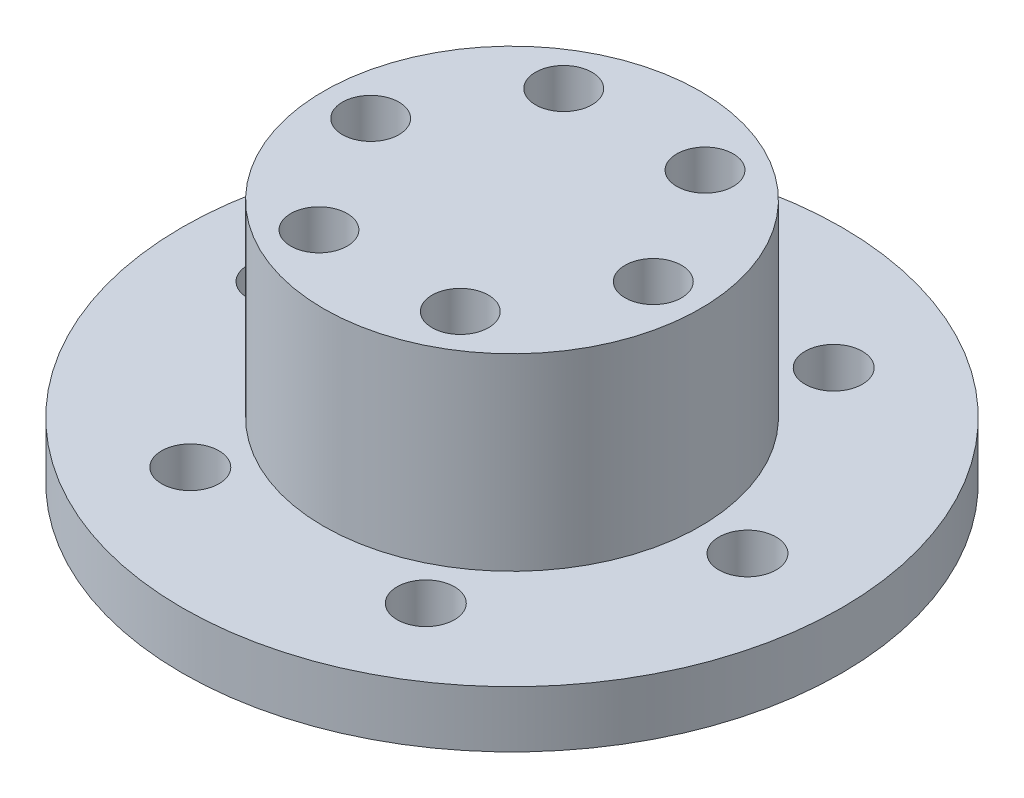
ISO-10303-21;
HEADER;
FILE_DESCRIPTION(('STEP AP214'),'2;1');
FILE_NAME('part.step','',(''),(''),'','','');
FILE_SCHEMA(('AUTOMOTIVE_DESIGN { 1 0 10303 214 1 1 1 1 }'));
ENDSEC;
DATA;
#1=APPLICATION_CONTEXT('core data for automotive mechanical design processes');
#2=APPLICATION_PROTOCOL_DEFINITION('international standard','automotive_design',2000,#1);
#3=PRODUCT_CONTEXT('',#1,'mechanical');
#4=PRODUCT('Part','Part','',(#3));
#5=PRODUCT_RELATED_PRODUCT_CATEGORY('part','',(#4));
#6=PRODUCT_DEFINITION_FORMATION('','',#4);
#7=PRODUCT_DEFINITION_CONTEXT('part definition',#1,'design');
#8=PRODUCT_DEFINITION('design','',#6,#7);
#9=PRODUCT_DEFINITION_SHAPE('','',#8);
#10=(LENGTH_UNIT() NAMED_UNIT(*) SI_UNIT(.MILLI.,.METRE.));
#11=(NAMED_UNIT(*) PLANE_ANGLE_UNIT() SI_UNIT($,.RADIAN.));
#12=(NAMED_UNIT(*) SI_UNIT($,.STERADIAN.) SOLID_ANGLE_UNIT());
#13=UNCERTAINTY_MEASURE_WITH_UNIT(LENGTH_MEASURE(1.E-05),#10,'distance_accuracy_value','');
#14=(GEOMETRIC_REPRESENTATION_CONTEXT(3) GLOBAL_UNCERTAINTY_ASSIGNED_CONTEXT((#13)) GLOBAL_UNIT_ASSIGNED_CONTEXT((#10,
#11,#12)) REPRESENTATION_CONTEXT('',''));
#15=CARTESIAN_POINT('',(0.,0.,0.));
#16=DIRECTION('',(0.,0.,1.));
#17=DIRECTION('',(1.,0.,0.));
#18=AXIS2_PLACEMENT_3D('',#15,#16,#17);
#19=CARTESIAN_POINT('',(0.,3.,0.));
#20=DIRECTION('',(0.,1.,0.));
#21=DIRECTION('',(0.,0.,1.));
#22=AXIS2_PLACEMENT_3D('',#19,#20,#21);
#23=PLANE('',#22);
#24=CARTESIAN_POINT('',(0.,3.,0.));
#25=DIRECTION('',(0.,1.,0.));
#26=DIRECTION('',(0.,0.,1.));
#27=AXIS2_PLACEMENT_3D('',#24,#25,#26);
#28=CIRCLE('',#27,10.);
#29=CARTESIAN_POINT('',(0.,3.,10.));
#30=VERTEX_POINT('',#29);
#31=EDGE_CURVE('E100',#30,#30,#28,.T.);
#32=ORIENTED_EDGE('',*,*,#31,.F.);
#33=EDGE_LOOP('',(#32));
#34=FACE_BOUND('',#33,.T.);
#35=CARTESIAN_POINT('',(-6.2499999999999,3.,-10.8253175473055));
#36=DIRECTION('',(0.,1.,0.));
#37=DIRECTION('',(0.,0.,1.));
#38=AXIS2_PLACEMENT_3D('',#35,#36,#37);
#39=CIRCLE('',#38,1.52);
#40=CARTESIAN_POINT('',(-6.2499999999999,3.,-9.30531754730555));
#41=VERTEX_POINT('',#40);
#42=EDGE_CURVE('E85',#41,#41,#39,.T.);
#43=ORIENTED_EDGE('',*,*,#42,.F.);
#44=EDGE_LOOP('',(#43));
#45=FACE_BOUND('',#44,.T.);
#46=CARTESIAN_POINT('',(-6.25000000000005,3.,10.8253175473055));
#47=DIRECTION('',(0.,1.,0.));
#48=DIRECTION('',(0.,0.,1.));
#49=AXIS2_PLACEMENT_3D('',#46,#47,#48);
#50=CIRCLE('',#49,1.52);
#51=CARTESIAN_POINT('',(-6.25000000000005,3.,12.3453175473055));
#52=VERTEX_POINT('',#51);
#53=EDGE_CURVE('E73',#52,#52,#50,.T.);
#54=ORIENTED_EDGE('',*,*,#53,.F.);
#55=EDGE_LOOP('',(#54));
#56=FACE_BOUND('',#55,.T.);
#57=CARTESIAN_POINT('',(12.5,3.,0.));
#58=DIRECTION('',(0.,1.,0.));
#59=DIRECTION('',(0.,0.,1.));
#60=AXIS2_PLACEMENT_3D('',#57,#58,#59);
#61=CIRCLE('',#60,1.52);
#62=CARTESIAN_POINT('',(12.5,3.,1.52));
#63=VERTEX_POINT('',#62);
#64=EDGE_CURVE('E61',#63,#63,#61,.T.);
#65=ORIENTED_EDGE('',*,*,#64,.F.);
#66=EDGE_LOOP('',(#65));
#67=FACE_BOUND('',#66,.T.);
#68=CARTESIAN_POINT('',(0.,3.,0.));
#69=DIRECTION('',(0.,1.,0.));
#70=DIRECTION('',(0.,0.,1.));
#71=AXIS2_PLACEMENT_3D('',#68,#69,#70);
#72=CIRCLE('',#71,17.5);
#73=CARTESIAN_POINT('',(0.,3.,17.5));
#74=VERTEX_POINT('',#73);
#75=EDGE_CURVE('E57',#74,#74,#72,.T.);
#76=ORIENTED_EDGE('',*,*,#75,.T.);
#77=EDGE_LOOP('',(#76));
#78=FACE_BOUND('',#77,.T.);
#79=CARTESIAN_POINT('',(6.24999999999998,3.,10.8253175473055));
#80=DIRECTION('',(0.,1.,0.));
#81=DIRECTION('',(0.,0.,1.));
#82=AXIS2_PLACEMENT_3D('',#79,#80,#81);
#83=CIRCLE('',#82,1.52);
#84=CARTESIAN_POINT('',(6.24999999999998,3.,12.3453175473055));
#85=VERTEX_POINT('',#84);
#86=EDGE_CURVE('E67',#85,#85,#83,.T.);
#87=ORIENTED_EDGE('',*,*,#86,.F.);
#88=EDGE_LOOP('',(#87));
#89=FACE_BOUND('',#88,.T.);
#90=CARTESIAN_POINT('',(-12.5,3.,0.));
#91=DIRECTION('',(0.,1.,0.));
#92=DIRECTION('',(0.,0.,1.));
#93=AXIS2_PLACEMENT_3D('',#90,#91,#92);
#94=CIRCLE('',#93,1.52);
#95=CARTESIAN_POINT('',(-12.5,3.,1.51999999999991));
#96=VERTEX_POINT('',#95);
#97=EDGE_CURVE('E79',#96,#96,#94,.T.);
#98=ORIENTED_EDGE('',*,*,#97,.F.);
#99=EDGE_LOOP('',(#98));
#100=FACE_BOUND('',#99,.T.);
#101=CARTESIAN_POINT('',(6.25000000000013,3.,-10.8253175473054));
#102=DIRECTION('',(0.,1.,0.));
#103=DIRECTION('',(0.,0.,1.));
#104=AXIS2_PLACEMENT_3D('',#101,#102,#103);
#105=CIRCLE('',#104,1.52);
#106=CARTESIAN_POINT('',(6.25000000000013,3.,-9.30531754730541));
#107=VERTEX_POINT('',#106);
#108=EDGE_CURVE('E91',#107,#107,#105,.T.);
#109=ORIENTED_EDGE('',*,*,#108,.F.);
#110=EDGE_LOOP('',(#109));
#111=FACE_BOUND('',#110,.T.);
#112=ADVANCED_FACE('F31',(#34,#45,#56,#67,#78,#89,#100,#111),#23,.T.);
#113=CARTESIAN_POINT('',(0.,0.,0.));
#114=DIRECTION('',(0.,1.,0.));
#115=DIRECTION('',(0.,0.,1.));
#116=AXIS2_PLACEMENT_3D('',#113,#114,#115);
#117=PLANE('',#116);
#118=CARTESIAN_POINT('',(0.,0.,0.));
#119=DIRECTION('',(0.,1.,0.));
#120=DIRECTION('',(0.,0.,1.));
#121=AXIS2_PLACEMENT_3D('',#118,#119,#120);
#122=CIRCLE('',#121,17.5);
#123=CARTESIAN_POINT('',(0.,0.,17.5));
#124=VERTEX_POINT('',#123);
#125=EDGE_CURVE('E58',#124,#124,#122,.T.);
#126=ORIENTED_EDGE('',*,*,#125,.F.);
#127=EDGE_LOOP('',(#126));
#128=FACE_BOUND('',#127,.T.);
#129=CARTESIAN_POINT('',(12.5,0.,0.));
#130=DIRECTION('',(0.,1.,0.));
#131=DIRECTION('',(0.,0.,1.));
#132=AXIS2_PLACEMENT_3D('',#129,#130,#131);
#133=CIRCLE('',#132,1.52);
#134=CARTESIAN_POINT('',(12.5,0.,1.52));
#135=VERTEX_POINT('',#134);
#136=EDGE_CURVE('E64',#135,#135,#133,.T.);
#137=ORIENTED_EDGE('',*,*,#136,.T.);
#138=EDGE_LOOP('',(#137));
#139=FACE_BOUND('',#138,.T.);
#140=CARTESIAN_POINT('',(6.24999999999998,0.,10.8253175473055));
#141=DIRECTION('',(0.,1.,0.));
#142=DIRECTION('',(0.,0.,1.));
#143=AXIS2_PLACEMENT_3D('',#140,#141,#142);
#144=CIRCLE('',#143,1.52);
#145=CARTESIAN_POINT('',(6.24999999999998,0.,12.3453175473055));
#146=VERTEX_POINT('',#145);
#147=EDGE_CURVE('E70',#146,#146,#144,.T.);
#148=ORIENTED_EDGE('',*,*,#147,.T.);
#149=EDGE_LOOP('',(#148));
#150=FACE_BOUND('',#149,.T.);
#151=CARTESIAN_POINT('',(-6.25000000000005,0.,10.8253175473055));
#152=DIRECTION('',(0.,1.,0.));
#153=DIRECTION('',(0.,0.,1.));
#154=AXIS2_PLACEMENT_3D('',#151,#152,#153);
#155=CIRCLE('',#154,1.52);
#156=CARTESIAN_POINT('',(-6.25000000000005,0.,12.3453175473055));
#157=VERTEX_POINT('',#156);
#158=EDGE_CURVE('E76',#157,#157,#155,.T.);
#159=ORIENTED_EDGE('',*,*,#158,.T.);
#160=EDGE_LOOP('',(#159));
#161=FACE_BOUND('',#160,.T.);
#162=CARTESIAN_POINT('',(-12.5,0.,0.));
#163=DIRECTION('',(0.,1.,0.));
#164=DIRECTION('',(0.,0.,1.));
#165=AXIS2_PLACEMENT_3D('',#162,#163,#164);
#166=CIRCLE('',#165,1.52);
#167=CARTESIAN_POINT('',(-12.5,0.,1.51999999999991));
#168=VERTEX_POINT('',#167);
#169=EDGE_CURVE('E82',#168,#168,#166,.T.);
#170=ORIENTED_EDGE('',*,*,#169,.T.);
#171=EDGE_LOOP('',(#170));
#172=FACE_BOUND('',#171,.T.);
#173=CARTESIAN_POINT('',(-6.2499999999999,0.,-10.8253175473055));
#174=DIRECTION('',(0.,1.,0.));
#175=DIRECTION('',(0.,0.,1.));
#176=AXIS2_PLACEMENT_3D('',#173,#174,#175);
#177=CIRCLE('',#176,1.52);
#178=CARTESIAN_POINT('',(-6.2499999999999,0.,-9.30531754730555));
#179=VERTEX_POINT('',#178);
#180=EDGE_CURVE('E88',#179,#179,#177,.T.);
#181=ORIENTED_EDGE('',*,*,#180,.T.);
#182=EDGE_LOOP('',(#181));
#183=FACE_BOUND('',#182,.T.);
#184=CARTESIAN_POINT('',(6.25000000000013,0.,-10.8253175473054));
#185=DIRECTION('',(0.,1.,0.));
#186=DIRECTION('',(0.,0.,1.));
#187=AXIS2_PLACEMENT_3D('',#184,#185,#186);
#188=CIRCLE('',#187,1.52);
#189=CARTESIAN_POINT('',(6.25000000000013,0.,-9.30531754730541));
#190=VERTEX_POINT('',#189);
#191=EDGE_CURVE('E94',#190,#190,#188,.T.);
#192=ORIENTED_EDGE('',*,*,#191,.T.);
#193=EDGE_LOOP('',(#192));
#194=FACE_BOUND('',#193,.T.);
#195=ADVANCED_FACE('F147',(#128,#139,#150,#161,#172,#183,#194),#117,.F.);
#196=CARTESIAN_POINT('',(0.,3.,0.));
#197=DIRECTION('',(0.,-1.,0.));
#198=DIRECTION('',(0.,0.,-1.));
#199=AXIS2_PLACEMENT_3D('',#196,#197,#198);
#200=CYLINDRICAL_SURFACE('',#199,17.5);
#201=ORIENTED_EDGE('',*,*,#75,.F.);
#202=EDGE_LOOP('',(#201));
#203=FACE_BOUND('',#202,.T.);
#204=ORIENTED_EDGE('',*,*,#125,.T.);
#205=EDGE_LOOP('',(#204));
#206=FACE_BOUND('',#205,.T.);
#207=ADVANCED_FACE('F33',(#203,#206),#200,.T.);
#208=CARTESIAN_POINT('',(12.5,3.,0.));
#209=DIRECTION('',(0.,-1.,0.));
#210=DIRECTION('',(0.,0.,-1.));
#211=AXIS2_PLACEMENT_3D('',#208,#209,#210);
#212=CYLINDRICAL_SURFACE('',#211,1.52);
#213=ORIENTED_EDGE('',*,*,#64,.T.);
#214=EDGE_LOOP('',(#213));
#215=FACE_BOUND('',#214,.T.);
#216=ORIENTED_EDGE('',*,*,#136,.F.);
#217=EDGE_LOOP('',(#216));
#218=FACE_BOUND('',#217,.T.);
#219=ADVANCED_FACE('F323',(#215,#218),#212,.F.);
#220=CARTESIAN_POINT('',(6.24999999999998,3.,10.8253175473055));
#221=DIRECTION('',(0.,-1.,0.));
#222=DIRECTION('',(0.,0.,-1.));
#223=AXIS2_PLACEMENT_3D('',#220,#221,#222);
#224=CYLINDRICAL_SURFACE('',#223,1.52);
#225=ORIENTED_EDGE('',*,*,#86,.T.);
#226=EDGE_LOOP('',(#225));
#227=FACE_BOUND('',#226,.T.);
#228=ORIENTED_EDGE('',*,*,#147,.F.);
#229=EDGE_LOOP('',(#228));
#230=FACE_BOUND('',#229,.T.);
#231=ADVANCED_FACE('F314',(#227,#230),#224,.F.);
#232=CARTESIAN_POINT('',(-6.25000000000005,3.,10.8253175473055));
#233=DIRECTION('',(0.,-1.,0.));
#234=DIRECTION('',(0.,0.,-1.));
#235=AXIS2_PLACEMENT_3D('',#232,#233,#234);
#236=CYLINDRICAL_SURFACE('',#235,1.52);
#237=ORIENTED_EDGE('',*,*,#53,.T.);
#238=EDGE_LOOP('',(#237));
#239=FACE_BOUND('',#238,.T.);
#240=ORIENTED_EDGE('',*,*,#158,.F.);
#241=EDGE_LOOP('',(#240));
#242=FACE_BOUND('',#241,.T.);
#243=ADVANCED_FACE('F305',(#239,#242),#236,.F.);
#244=CARTESIAN_POINT('',(-12.5,3.,0.));
#245=DIRECTION('',(0.,-1.,0.));
#246=DIRECTION('',(0.,0.,-1.));
#247=AXIS2_PLACEMENT_3D('',#244,#245,#246);
#248=CYLINDRICAL_SURFACE('',#247,1.52);
#249=ORIENTED_EDGE('',*,*,#97,.T.);
#250=EDGE_LOOP('',(#249));
#251=FACE_BOUND('',#250,.T.);
#252=ORIENTED_EDGE('',*,*,#169,.F.);
#253=EDGE_LOOP('',(#252));
#254=FACE_BOUND('',#253,.T.);
#255=ADVANCED_FACE('F296',(#251,#254),#248,.F.);
#256=CARTESIAN_POINT('',(-6.2499999999999,3.,-10.8253175473055));
#257=DIRECTION('',(0.,-1.,0.));
#258=DIRECTION('',(0.,0.,-1.));
#259=AXIS2_PLACEMENT_3D('',#256,#257,#258);
#260=CYLINDRICAL_SURFACE('',#259,1.52);
#261=ORIENTED_EDGE('',*,*,#42,.T.);
#262=EDGE_LOOP('',(#261));
#263=FACE_BOUND('',#262,.T.);
#264=ORIENTED_EDGE('',*,*,#180,.F.);
#265=EDGE_LOOP('',(#264));
#266=FACE_BOUND('',#265,.T.);
#267=ADVANCED_FACE('F140',(#263,#266),#260,.F.);
#268=CARTESIAN_POINT('',(6.25000000000013,3.,-10.8253175473054));
#269=DIRECTION('',(0.,-1.,0.));
#270=DIRECTION('',(0.,0.,-1.));
#271=AXIS2_PLACEMENT_3D('',#268,#269,#270);
#272=CYLINDRICAL_SURFACE('',#271,1.52);
#273=ORIENTED_EDGE('',*,*,#108,.T.);
#274=EDGE_LOOP('',(#273));
#275=FACE_BOUND('',#274,.T.);
#276=ORIENTED_EDGE('',*,*,#191,.F.);
#277=EDGE_LOOP('',(#276));
#278=FACE_BOUND('',#277,.T.);
#279=ADVANCED_FACE('F130',(#275,#278),#272,.F.);
#280=CARTESIAN_POINT('',(0.,13.,0.));
#281=DIRECTION('',(0.,1.,0.));
#282=DIRECTION('',(0.,0.,1.));
#283=AXIS2_PLACEMENT_3D('',#280,#281,#282);
#284=PLANE('',#283);
#285=CARTESIAN_POINT('',(-3.74999999999994,13.,-6.49519052838333));
#286=DIRECTION('',(0.,1.,0.));
#287=DIRECTION('',(0.,0.,1.));
#288=AXIS2_PLACEMENT_3D('',#285,#286,#287);
#289=CIRCLE('',#288,1.5);
#290=CARTESIAN_POINT('',(-3.74999999999994,13.,-4.99519052838333));
#291=VERTEX_POINT('',#290);
#292=EDGE_CURVE('E117',#291,#291,#289,.T.);
#293=ORIENTED_EDGE('',*,*,#292,.F.);
#294=EDGE_LOOP('',(#293));
#295=FACE_BOUND('',#294,.T.);
#296=CARTESIAN_POINT('',(-3.75000000000003,13.,6.49519052838327));
#297=DIRECTION('',(0.,1.,0.));
#298=DIRECTION('',(0.,0.,1.));
#299=AXIS2_PLACEMENT_3D('',#296,#297,#298);
#300=CIRCLE('',#299,1.5);
#301=CARTESIAN_POINT('',(-3.75000000000003,13.,7.99519052838327));
#302=VERTEX_POINT('',#301);
#303=EDGE_CURVE('E111',#302,#302,#300,.T.);
#304=ORIENTED_EDGE('',*,*,#303,.F.);
#305=EDGE_LOOP('',(#304));
#306=FACE_BOUND('',#305,.T.);
#307=CARTESIAN_POINT('',(7.5,13.,0.));
#308=DIRECTION('',(0.,1.,0.));
#309=DIRECTION('',(0.,0.,1.));
#310=AXIS2_PLACEMENT_3D('',#307,#308,#309);
#311=CIRCLE('',#310,1.5);
#312=CARTESIAN_POINT('',(7.5,13.,1.5));
#313=VERTEX_POINT('',#312);
#314=EDGE_CURVE('E103',#313,#313,#311,.T.);
#315=ORIENTED_EDGE('',*,*,#314,.F.);
#316=EDGE_LOOP('',(#315));
#317=FACE_BOUND('',#316,.T.);
#318=CARTESIAN_POINT('',(0.,13.,0.));
#319=DIRECTION('',(0.,1.,0.));
#320=DIRECTION('',(0.,0.,1.));
#321=AXIS2_PLACEMENT_3D('',#318,#319,#320);
#322=CIRCLE('',#321,10.);
#323=CARTESIAN_POINT('',(0.,13.,10.));
#324=VERTEX_POINT('',#323);
#325=EDGE_CURVE('E97',#324,#324,#322,.T.);
#326=ORIENTED_EDGE('',*,*,#325,.T.);
#327=EDGE_LOOP('',(#326));
#328=FACE_BOUND('',#327,.T.);
#329=CARTESIAN_POINT('',(3.74999999999998,13.,6.4951905283833));
#330=DIRECTION('',(0.,1.,0.));
#331=DIRECTION('',(0.,0.,1.));
#332=AXIS2_PLACEMENT_3D('',#329,#330,#331);
#333=CIRCLE('',#332,1.5);
#334=CARTESIAN_POINT('',(3.74999999999998,13.,7.9951905283833));
#335=VERTEX_POINT('',#334);
#336=EDGE_CURVE('E108',#335,#335,#333,.T.);
#337=ORIENTED_EDGE('',*,*,#336,.F.);
#338=EDGE_LOOP('',(#337));
#339=FACE_BOUND('',#338,.T.);
#340=CARTESIAN_POINT('',(-7.5,13.,0.));
#341=DIRECTION('',(0.,1.,0.));
#342=DIRECTION('',(0.,0.,1.));
#343=AXIS2_PLACEMENT_3D('',#340,#341,#342);
#344=CIRCLE('',#343,1.5);
#345=CARTESIAN_POINT('',(-7.5,13.,1.49999999999995));
#346=VERTEX_POINT('',#345);
#347=EDGE_CURVE('E114',#346,#346,#344,.T.);
#348=ORIENTED_EDGE('',*,*,#347,.F.);
#349=EDGE_LOOP('',(#348));
#350=FACE_BOUND('',#349,.T.);
#351=CARTESIAN_POINT('',(3.75000000000008,13.,-6.49519052838325));
#352=DIRECTION('',(0.,1.,0.));
#353=DIRECTION('',(0.,0.,1.));
#354=AXIS2_PLACEMENT_3D('',#351,#352,#353);
#355=CIRCLE('',#354,1.5);
#356=CARTESIAN_POINT('',(3.75000000000008,13.,-4.99519052838325));
#357=VERTEX_POINT('',#356);
#358=EDGE_CURVE('E120',#357,#357,#355,.T.);
#359=ORIENTED_EDGE('',*,*,#358,.F.);
#360=EDGE_LOOP('',(#359));
#361=FACE_BOUND('',#360,.T.);
#362=ADVANCED_FACE('F127',(#295,#306,#317,#328,#339,#350,#361),#284,.T.);
#363=CARTESIAN_POINT('',(0.,13.,0.));
#364=DIRECTION('',(0.,-1.,0.));
#365=DIRECTION('',(0.,0.,-1.));
#366=AXIS2_PLACEMENT_3D('',#363,#364,#365);
#367=CYLINDRICAL_SURFACE('',#366,10.);
#368=ORIENTED_EDGE('',*,*,#325,.F.);
#369=EDGE_LOOP('',(#368));
#370=FACE_BOUND('',#369,.T.);
#371=ORIENTED_EDGE('',*,*,#31,.T.);
#372=EDGE_LOOP('',(#371));
#373=FACE_BOUND('',#372,.T.);
#374=ADVANCED_FACE('F129',(#370,#373),#367,.T.);
#375=CARTESIAN_POINT('',(7.5,13.,0.));
#376=DIRECTION('',(0.,-1.,0.));
#377=DIRECTION('',(0.,0.,-1.));
#378=AXIS2_PLACEMENT_3D('',#375,#376,#377);
#379=CYLINDRICAL_SURFACE('',#378,1.5);
#380=ORIENTED_EDGE('',*,*,#314,.T.);
#381=EDGE_LOOP('',(#380));
#382=FACE_BOUND('',#381,.T.);
#383=CARTESIAN_POINT('',(7.5,3.,0.));
#384=DIRECTION('',(0.,1.,0.));
#385=DIRECTION('',(0.,0.,1.));
#386=AXIS2_PLACEMENT_3D('',#383,#384,#385);
#387=CIRCLE('',#386,1.5);
#388=CARTESIAN_POINT('',(7.5,3.,1.5));
#389=VERTEX_POINT('',#388);
#390=EDGE_CURVE('E10',#389,#389,#387,.F.);
#391=ORIENTED_EDGE('',*,*,#390,.T.);
#392=EDGE_LOOP('',(#391));
#393=FACE_BOUND('',#392,.T.);
#394=ADVANCED_FACE('F137',(#382,#393),#379,.F.);
#395=CARTESIAN_POINT('',(3.74999999999998,13.,6.4951905283833));
#396=DIRECTION('',(0.,-1.,0.));
#397=DIRECTION('',(0.,0.,-1.));
#398=AXIS2_PLACEMENT_3D('',#395,#396,#397);
#399=CYLINDRICAL_SURFACE('',#398,1.5);
#400=ORIENTED_EDGE('',*,*,#336,.T.);
#401=EDGE_LOOP('',(#400));
#402=FACE_BOUND('',#401,.T.);
#403=CARTESIAN_POINT('',(3.74999999999998,3.,6.4951905283833));
#404=DIRECTION('',(0.,1.,0.));
#405=DIRECTION('',(0.,0.,1.));
#406=AXIS2_PLACEMENT_3D('',#403,#404,#405);
#407=CIRCLE('',#406,1.5);
#408=CARTESIAN_POINT('',(3.74999999999998,3.,7.9951905283833));
#409=VERTEX_POINT('',#408);
#410=EDGE_CURVE('E38',#409,#409,#407,.F.);
#411=ORIENTED_EDGE('',*,*,#410,.T.);
#412=EDGE_LOOP('',(#411));
#413=FACE_BOUND('',#412,.T.);
#414=ADVANCED_FACE('F187',(#402,#413),#399,.F.);
#415=CARTESIAN_POINT('',(-3.75000000000003,13.,6.49519052838327));
#416=DIRECTION('',(0.,-1.,0.));
#417=DIRECTION('',(0.,0.,-1.));
#418=AXIS2_PLACEMENT_3D('',#415,#416,#417);
#419=CYLINDRICAL_SURFACE('',#418,1.5);
#420=ORIENTED_EDGE('',*,*,#303,.T.);
#421=EDGE_LOOP('',(#420));
#422=FACE_BOUND('',#421,.T.);
#423=CARTESIAN_POINT('',(-3.75000000000003,3.,6.49519052838327));
#424=DIRECTION('',(0.,1.,0.));
#425=DIRECTION('',(0.,0.,1.));
#426=AXIS2_PLACEMENT_3D('',#423,#424,#425);
#427=CIRCLE('',#426,1.5);
#428=CARTESIAN_POINT('',(-3.75000000000003,3.,7.99519052838327));
#429=VERTEX_POINT('',#428);
#430=EDGE_CURVE('E42',#429,#429,#427,.F.);
#431=ORIENTED_EDGE('',*,*,#430,.T.);
#432=EDGE_LOOP('',(#431));
#433=FACE_BOUND('',#432,.T.);
#434=ADVANCED_FACE('F183',(#422,#433),#419,.F.);
#435=CARTESIAN_POINT('',(-7.5,13.,0.));
#436=DIRECTION('',(0.,-1.,0.));
#437=DIRECTION('',(0.,0.,-1.));
#438=AXIS2_PLACEMENT_3D('',#435,#436,#437);
#439=CYLINDRICAL_SURFACE('',#438,1.5);
#440=ORIENTED_EDGE('',*,*,#347,.T.);
#441=EDGE_LOOP('',(#440));
#442=FACE_BOUND('',#441,.T.);
#443=CARTESIAN_POINT('',(-7.5,3.,0.));
#444=DIRECTION('',(0.,1.,0.));
#445=DIRECTION('',(0.,0.,1.));
#446=AXIS2_PLACEMENT_3D('',#443,#444,#445);
#447=CIRCLE('',#446,1.5);
#448=CARTESIAN_POINT('',(-7.5,3.,1.49999999999995));
#449=VERTEX_POINT('',#448);
#450=EDGE_CURVE('E46',#449,#449,#447,.F.);
#451=ORIENTED_EDGE('',*,*,#450,.T.);
#452=EDGE_LOOP('',(#451));
#453=FACE_BOUND('',#452,.T.);
#454=ADVANCED_FACE('F177',(#442,#453),#439,.F.);
#455=CARTESIAN_POINT('',(-3.74999999999994,13.,-6.49519052838333));
#456=DIRECTION('',(0.,-1.,0.));
#457=DIRECTION('',(0.,0.,-1.));
#458=AXIS2_PLACEMENT_3D('',#455,#456,#457);
#459=CYLINDRICAL_SURFACE('',#458,1.5);
#460=ORIENTED_EDGE('',*,*,#292,.T.);
#461=EDGE_LOOP('',(#460));
#462=FACE_BOUND('',#461,.T.);
#463=CARTESIAN_POINT('',(-3.74999999999994,3.,-6.49519052838333));
#464=DIRECTION('',(0.,1.,0.));
#465=DIRECTION('',(0.,0.,1.));
#466=AXIS2_PLACEMENT_3D('',#463,#464,#465);
#467=CIRCLE('',#466,1.5);
#468=CARTESIAN_POINT('',(-3.74999999999994,3.,-4.99519052838333));
#469=VERTEX_POINT('',#468);
#470=EDGE_CURVE('E51',#469,#469,#467,.F.);
#471=ORIENTED_EDGE('',*,*,#470,.T.);
#472=EDGE_LOOP('',(#471));
#473=FACE_BOUND('',#472,.T.);
#474=ADVANCED_FACE('F171',(#462,#473),#459,.F.);
#475=CARTESIAN_POINT('',(3.75000000000008,13.,-6.49519052838325));
#476=DIRECTION('',(0.,-1.,0.));
#477=DIRECTION('',(0.,0.,-1.));
#478=AXIS2_PLACEMENT_3D('',#475,#476,#477);
#479=CYLINDRICAL_SURFACE('',#478,1.5);
#480=ORIENTED_EDGE('',*,*,#358,.T.);
#481=EDGE_LOOP('',(#480));
#482=FACE_BOUND('',#481,.T.);
#483=CARTESIAN_POINT('',(3.75000000000008,3.,-6.49519052838325));
#484=DIRECTION('',(0.,1.,0.));
#485=DIRECTION('',(0.,0.,1.));
#486=AXIS2_PLACEMENT_3D('',#483,#484,#485);
#487=CIRCLE('',#486,1.5);
#488=CARTESIAN_POINT('',(3.75000000000008,3.,-4.99519052838325));
#489=VERTEX_POINT('',#488);
#490=EDGE_CURVE('E54',#489,#489,#487,.F.);
#491=ORIENTED_EDGE('',*,*,#490,.T.);
#492=EDGE_LOOP('',(#491));
#493=FACE_BOUND('',#492,.T.);
#494=ADVANCED_FACE('F124',(#482,#493),#479,.F.);
#495=ORIENTED_EDGE('',*,*,#490,.F.);
#496=EDGE_LOOP('',(#495));
#497=FACE_BOUND('',#496,.T.);
#498=ADVANCED_FACE('F151',(#497),#23,.T.);
#499=ORIENTED_EDGE('',*,*,#470,.F.);
#500=EDGE_LOOP('',(#499));
#501=FACE_BOUND('',#500,.T.);
#502=ADVANCED_FACE('F163',(#501),#23,.T.);
#503=ORIENTED_EDGE('',*,*,#450,.F.);
#504=EDGE_LOOP('',(#503));
#505=FACE_BOUND('',#504,.T.);
#506=ADVANCED_FACE('F169',(#505),#23,.T.);
#507=ORIENTED_EDGE('',*,*,#430,.F.);
#508=EDGE_LOOP('',(#507));
#509=FACE_BOUND('',#508,.T.);
#510=ADVANCED_FACE('F207',(#509),#23,.T.);
#511=ORIENTED_EDGE('',*,*,#410,.F.);
#512=EDGE_LOOP('',(#511));
#513=FACE_BOUND('',#512,.T.);
#514=ADVANCED_FACE('F160',(#513),#23,.T.);
#515=ORIENTED_EDGE('',*,*,#390,.F.);
#516=EDGE_LOOP('',(#515));
#517=FACE_BOUND('',#516,.T.);
#518=ADVANCED_FACE('F150',(#517),#23,.T.);
#519=CLOSED_SHELL('',(#112,#195,#207,#219,#231,#243,#255,#267,#279,#362,#374,#394,#414,#434,
#454,#474,#494,#498,#502,#506,#510,#514,#518));
#520=MANIFOLD_SOLID_BREP('B2',#519);
#521=ADVANCED_BREP_SHAPE_REPRESENTATION('',(#18,#520),#14);
#522=SHAPE_DEFINITION_REPRESENTATION(#9,#521);
ENDSEC;
END-ISO-10303-21;
